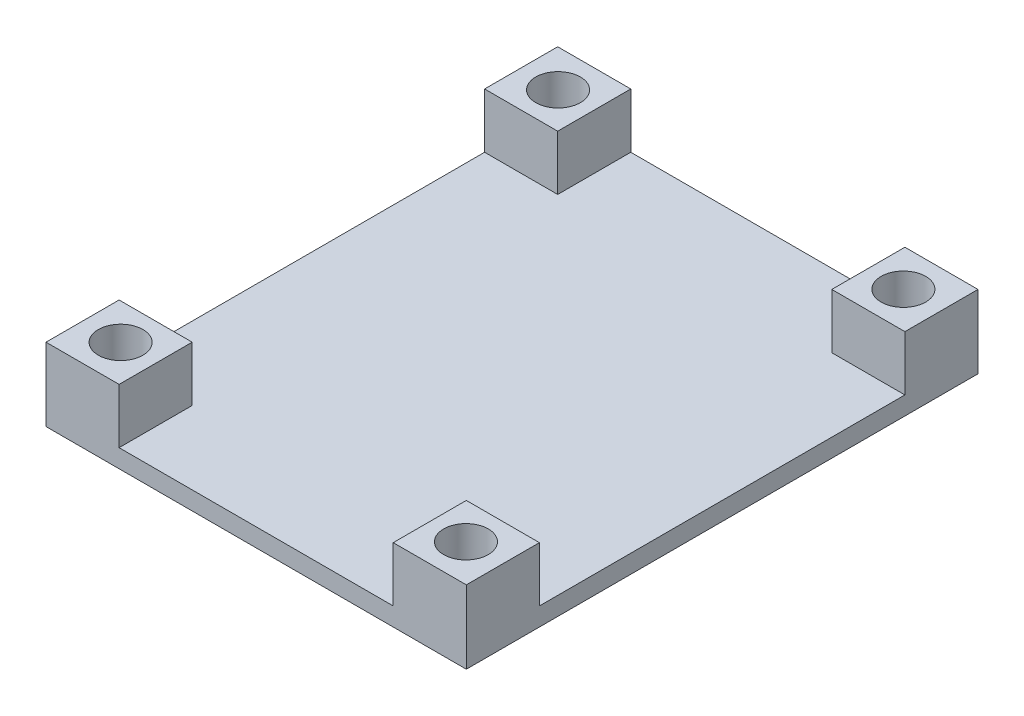
ISO-10303-21;
HEADER;
FILE_DESCRIPTION(('STEP AP214'),'2;1');
FILE_NAME('part.step','',(''),(''),'','','');
FILE_SCHEMA(('AUTOMOTIVE_DESIGN { 1 0 10303 214 1 1 1 1 }'));
ENDSEC;
DATA;
#1=APPLICATION_CONTEXT('core data for automotive mechanical design processes');
#2=APPLICATION_PROTOCOL_DEFINITION('international standard','automotive_design',2000,#1);
#3=PRODUCT_CONTEXT('',#1,'mechanical');
#4=PRODUCT('Part','Part','',(#3));
#5=PRODUCT_RELATED_PRODUCT_CATEGORY('part','',(#4));
#6=PRODUCT_DEFINITION_FORMATION('','',#4);
#7=PRODUCT_DEFINITION_CONTEXT('part definition',#1,'design');
#8=PRODUCT_DEFINITION('design','',#6,#7);
#9=PRODUCT_DEFINITION_SHAPE('','',#8);
#10=(LENGTH_UNIT() NAMED_UNIT(*) SI_UNIT(.MILLI.,.METRE.));
#11=(NAMED_UNIT(*) PLANE_ANGLE_UNIT() SI_UNIT($,.RADIAN.));
#12=(NAMED_UNIT(*) SI_UNIT($,.STERADIAN.) SOLID_ANGLE_UNIT());
#13=UNCERTAINTY_MEASURE_WITH_UNIT(LENGTH_MEASURE(1.E-05),#10,'distance_accuracy_value','');
#14=(GEOMETRIC_REPRESENTATION_CONTEXT(3) GLOBAL_UNCERTAINTY_ASSIGNED_CONTEXT((#13)) GLOBAL_UNIT_ASSIGNED_CONTEXT((#10,
#11,#12)) REPRESENTATION_CONTEXT('',''));
#15=CARTESIAN_POINT('',(0.,0.,0.));
#16=DIRECTION('',(0.,0.,1.));
#17=DIRECTION('',(1.,0.,0.));
#18=AXIS2_PLACEMENT_3D('',#15,#16,#17);
#19=CARTESIAN_POINT('',(0.,5.08,0.));
#20=DIRECTION('',(0.,1.,0.));
#21=DIRECTION('',(0.,0.,1.));
#22=AXIS2_PLACEMENT_3D('',#19,#20,#21);
#23=PLANE('',#22);
#24=DIRECTION('',(-1.,0.,0.));
#25=VECTOR('',#24,1.);
#26=CARTESIAN_POINT('',(0.,5.08,-9.19483735294118));
#27=LINE('',#26,#25);
#28=CARTESIAN_POINT('',(-7.31370588235292,5.08,-9.19483735294118));
#29=VERTEX_POINT('',#28);
#30=CARTESIAN_POINT('',(-12.3937058823529,5.08,-9.19483735294118));
#31=VERTEX_POINT('',#30);
#32=EDGE_CURVE('E180',#29,#31,#27,.T.);
#33=ORIENTED_EDGE('',*,*,#32,.F.);
#34=DIRECTION('',(0.,0.,-1.));
#35=VECTOR('',#34,1.);
#36=CARTESIAN_POINT('',(-7.31370588235292,5.08,0.));
#37=LINE('',#36,#35);
#38=CARTESIAN_POINT('',(-7.31370588235292,5.08,-14.2748373529412));
#39=VERTEX_POINT('',#38);
#40=EDGE_CURVE('E219',#29,#39,#37,.T.);
#41=ORIENTED_EDGE('',*,*,#40,.T.);
#42=DIRECTION('',(-1.,0.,0.));
#43=VECTOR('',#42,1.);
#44=CARTESIAN_POINT('',(-12.3937058823529,5.08,-14.2748373529412));
#45=LINE('',#44,#43);
#46=CARTESIAN_POINT('',(-12.3937058823529,5.08,-14.2748373529412));
#47=VERTEX_POINT('',#46);
#48=EDGE_CURVE('E57',#39,#47,#45,.T.);
#49=ORIENTED_EDGE('',*,*,#48,.T.);
#50=DIRECTION('',(0.,0.,1.));
#51=VECTOR('',#50,1.);
#52=CARTESIAN_POINT('',(-12.3937058823529,5.08,-14.2748373529412));
#53=LINE('',#52,#51);
#54=EDGE_CURVE('E271',#47,#31,#53,.T.);
#55=ORIENTED_EDGE('',*,*,#54,.T.);
#56=EDGE_LOOP('',(#33,#41,#49,#55));
#57=FACE_BOUND('',#56,.T.);
#58=CARTESIAN_POINT('',(-9.78870728235293,5.08,-11.6948323529412));
#59=DIRECTION('',(0.,1.,0.));
#60=DIRECTION('',(0.,0.,1.));
#61=AXIS2_PLACEMENT_3D('',#58,#59,#60);
#62=CIRCLE('',#61,1.5499969);
#63=CARTESIAN_POINT('',(-9.78870728235293,5.08,-10.1448354529412));
#64=VERTEX_POINT('',#63);
#65=EDGE_CURVE('E265',#64,#64,#62,.T.);
#66=ORIENTED_EDGE('',*,*,#65,.F.);
#67=EDGE_LOOP('',(#66));
#68=FACE_BOUND('',#67,.T.);
#69=ADVANCED_FACE('F33',(#57,#68),#23,.T.);
#70=DIRECTION('',(0.,0.,-1.));
#71=VECTOR('',#70,1.);
#72=CARTESIAN_POINT('',(11.7362941176471,5.08,0.));
#73=LINE('',#72,#71);
#74=CARTESIAN_POINT('',(11.7362941176471,5.08,-9.19483735294118));
#75=VERTEX_POINT('',#74);
#76=CARTESIAN_POINT('',(11.7362941176471,5.08,-14.2748373529412));
#77=VERTEX_POINT('',#76);
#78=EDGE_CURVE('E217',#75,#77,#73,.T.);
#79=ORIENTED_EDGE('',*,*,#78,.F.);
#80=DIRECTION('',(1.,0.,0.));
#81=VECTOR('',#80,1.);
#82=CARTESIAN_POINT('',(0.,5.08,-9.19483735294118));
#83=LINE('',#82,#81);
#84=CARTESIAN_POINT('',(16.8162941176471,5.08,-9.19483735294118));
#85=VERTEX_POINT('',#84);
#86=EDGE_CURVE('E214',#75,#85,#83,.T.);
#87=ORIENTED_EDGE('',*,*,#86,.T.);
#88=DIRECTION('',(0.,0.,-1.));
#89=VECTOR('',#88,1.);
#90=CARTESIAN_POINT('',(16.8162941176471,5.08,-14.2748373529412));
#91=LINE('',#90,#89);
#92=CARTESIAN_POINT('',(16.8162941176471,5.08,-14.2748373529412));
#93=VERTEX_POINT('',#92);
#94=EDGE_CURVE('E276',#85,#93,#91,.T.);
#95=ORIENTED_EDGE('',*,*,#94,.T.);
#96=EDGE_CURVE('E280',#93,#77,#45,.T.);
#97=ORIENTED_EDGE('',*,*,#96,.T.);
#98=EDGE_LOOP('',(#79,#87,#95,#97));
#99=FACE_BOUND('',#98,.T.);
#100=CARTESIAN_POINT('',(14.2112955176471,5.08,-11.6948323529412));
#101=DIRECTION('',(0.,1.,0.));
#102=DIRECTION('',(0.,0.,1.));
#103=AXIS2_PLACEMENT_3D('',#100,#101,#102);
#104=CIRCLE('',#103,1.5499969);
#105=CARTESIAN_POINT('',(14.2112955176471,5.08,-10.1448354529412));
#106=VERTEX_POINT('',#105);
#107=EDGE_CURVE('E259',#106,#106,#104,.T.);
#108=ORIENTED_EDGE('',*,*,#107,.F.);
#109=EDGE_LOOP('',(#108));
#110=FACE_BOUND('',#109,.T.);
#111=ADVANCED_FACE('F347',(#99,#110),#23,.T.);
#112=CARTESIAN_POINT('',(-9.78870728235293,5.08,18.7051576470588));
#113=DIRECTION('',(0.,1.,0.));
#114=DIRECTION('',(0.,0.,1.));
#115=AXIS2_PLACEMENT_3D('',#112,#113,#114);
#116=CIRCLE('',#115,1.5499969);
#117=CARTESIAN_POINT('',(-9.78870728235293,5.08,20.2551545470588));
#118=VERTEX_POINT('',#117);
#119=EDGE_CURVE('E247',#118,#118,#116,.T.);
#120=ORIENTED_EDGE('',*,*,#119,.F.);
#121=EDGE_LOOP('',(#120));
#122=FACE_BOUND('',#121,.T.);
#123=DIRECTION('',(0.,0.,1.));
#124=VECTOR('',#123,1.);
#125=CARTESIAN_POINT('',(-7.31370588235292,5.08,0.));
#126=LINE('',#125,#124);
#127=CARTESIAN_POINT('',(-7.31370588235292,5.08,16.2051626470588));
#128=VERTEX_POINT('',#127);
#129=CARTESIAN_POINT('',(-7.31370588235292,5.08,21.2851626470588));
#130=VERTEX_POINT('',#129);
#131=EDGE_CURVE('E207',#128,#130,#126,.T.);
#132=ORIENTED_EDGE('',*,*,#131,.F.);
#133=DIRECTION('',(-1.,0.,0.));
#134=VECTOR('',#133,1.);
#135=CARTESIAN_POINT('',(0.,5.08,16.2051626470588));
#136=LINE('',#135,#134);
#137=CARTESIAN_POINT('',(-12.3937058823529,5.08,16.2051626470588));
#138=VERTEX_POINT('',#137);
#139=EDGE_CURVE('E165',#128,#138,#136,.T.);
#140=ORIENTED_EDGE('',*,*,#139,.T.);
#141=CARTESIAN_POINT('',(-12.3937058823529,5.08,21.2851626470588));
#142=VERTEX_POINT('',#141);
#143=EDGE_CURVE('E87',#138,#142,#53,.T.);
#144=ORIENTED_EDGE('',*,*,#143,.T.);
#145=DIRECTION('',(1.,0.,0.));
#146=VECTOR('',#145,1.);
#147=CARTESIAN_POINT('',(-12.3937058823529,5.08,21.2851626470588));
#148=LINE('',#147,#146);
#149=EDGE_CURVE('E274',#142,#130,#148,.T.);
#150=ORIENTED_EDGE('',*,*,#149,.T.);
#151=EDGE_LOOP('',(#132,#140,#144,#150));
#152=FACE_BOUND('',#151,.T.);
#153=ADVANCED_FACE('F322',(#122,#152),#23,.T.);
#154=CARTESIAN_POINT('',(-12.3937058823529,5.08,-14.2748373529412));
#155=DIRECTION('',(1.,0.,0.));
#156=DIRECTION('',(0.,0.,-1.));
#157=AXIS2_PLACEMENT_3D('',#154,#155,#156);
#158=PLANE('',#157);
#159=DIRECTION('',(0.,1.,0.));
#160=VECTOR('',#159,1.);
#161=CARTESIAN_POINT('',(-12.3937058823529,1.27,16.2051626470588));
#162=LINE('',#161,#160);
#163=CARTESIAN_POINT('',(-12.3937058823529,1.27,16.2051626470588));
#164=VERTEX_POINT('',#163);
#165=EDGE_CURVE('E222',#164,#138,#162,.T.);
#166=ORIENTED_EDGE('',*,*,#165,.F.);
#167=DIRECTION('',(0.,0.,1.));
#168=VECTOR('',#167,1.);
#169=CARTESIAN_POINT('',(-12.3937058823529,1.27,0.));
#170=LINE('',#169,#168);
#171=CARTESIAN_POINT('',(-12.3937058823529,1.27,-9.19483735294118));
#172=VERTEX_POINT('',#171);
#173=EDGE_CURVE('E170',#172,#164,#170,.T.);
#174=ORIENTED_EDGE('',*,*,#173,.F.);
#175=DIRECTION('',(0.,1.,0.));
#176=VECTOR('',#175,1.);
#177=CARTESIAN_POINT('',(-12.3937058823529,1.27,-9.19483735294118));
#178=LINE('',#177,#176);
#179=EDGE_CURVE('E225',#172,#31,#178,.T.);
#180=ORIENTED_EDGE('',*,*,#179,.T.);
#181=ORIENTED_EDGE('',*,*,#54,.F.);
#182=DIRECTION('',(0.,-1.,0.));
#183=VECTOR('',#182,1.);
#184=CARTESIAN_POINT('',(-12.3937058823529,5.08,-14.2748373529412));
#185=LINE('',#184,#183);
#186=CARTESIAN_POINT('',(-12.3937058823529,0.,-14.2748373529412));
#187=VERTEX_POINT('',#186);
#188=EDGE_CURVE('E283',#47,#187,#185,.T.);
#189=ORIENTED_EDGE('',*,*,#188,.T.);
#190=DIRECTION('',(0.,0.,1.));
#191=VECTOR('',#190,1.);
#192=CARTESIAN_POINT('',(-12.3937058823529,0.,-14.2748373529412));
#193=LINE('',#192,#191);
#194=CARTESIAN_POINT('',(-12.3937058823529,0.,21.2851626470588));
#195=VERTEX_POINT('',#194);
#196=EDGE_CURVE('E268',#187,#195,#193,.T.);
#197=ORIENTED_EDGE('',*,*,#196,.T.);
#198=DIRECTION('',(0.,-1.,0.));
#199=VECTOR('',#198,1.);
#200=CARTESIAN_POINT('',(-12.3937058823529,5.08,21.2851626470588));
#201=LINE('',#200,#199);
#202=EDGE_CURVE('E11',#142,#195,#201,.T.);
#203=ORIENTED_EDGE('',*,*,#202,.F.);
#204=ORIENTED_EDGE('',*,*,#143,.F.);
#205=EDGE_LOOP('',(#166,#174,#180,#181,#189,#197,#203,#204));
#206=FACE_BOUND('',#205,.T.);
#207=ADVANCED_FACE('F35',(#206),#158,.F.);
#208=CARTESIAN_POINT('',(-12.3937058823529,5.08,21.2851626470588));
#209=DIRECTION('',(0.,0.,-1.));
#210=DIRECTION('',(-1.,0.,0.));
#211=AXIS2_PLACEMENT_3D('',#208,#209,#210);
#212=PLANE('',#211);
#213=DIRECTION('',(0.,1.,0.));
#214=VECTOR('',#213,1.);
#215=CARTESIAN_POINT('',(11.7362941176471,1.27,21.2851626470588));
#216=LINE('',#215,#214);
#217=CARTESIAN_POINT('',(11.7362941176471,1.27,21.2851626470588));
#218=VERTEX_POINT('',#217);
#219=CARTESIAN_POINT('',(11.7362941176471,5.08,21.2851626470588));
#220=VERTEX_POINT('',#219);
#221=EDGE_CURVE('E244',#218,#220,#216,.T.);
#222=ORIENTED_EDGE('',*,*,#221,.F.);
#223=DIRECTION('',(1.,0.,0.));
#224=VECTOR('',#223,1.);
#225=CARTESIAN_POINT('',(0.,1.27,21.2851626470588));
#226=LINE('',#225,#224);
#227=CARTESIAN_POINT('',(-7.31370588235292,1.27,21.2851626470588));
#228=VERTEX_POINT('',#227);
#229=EDGE_CURVE('E184',#228,#218,#226,.T.);
#230=ORIENTED_EDGE('',*,*,#229,.F.);
#231=DIRECTION('',(0.,1.,0.));
#232=VECTOR('',#231,1.);
#233=CARTESIAN_POINT('',(-7.31370588235292,1.27,21.2851626470588));
#234=LINE('',#233,#232);
#235=EDGE_CURVE('E169',#228,#130,#234,.T.);
#236=ORIENTED_EDGE('',*,*,#235,.T.);
#237=ORIENTED_EDGE('',*,*,#149,.F.);
#238=ORIENTED_EDGE('',*,*,#202,.T.);
#239=DIRECTION('',(1.,0.,0.));
#240=VECTOR('',#239,1.);
#241=CARTESIAN_POINT('',(-12.3937058823529,0.,21.2851626470588));
#242=LINE('',#241,#240);
#243=CARTESIAN_POINT('',(16.8162941176471,0.,21.2851626470588));
#244=VERTEX_POINT('',#243);
#245=EDGE_CURVE('E286',#195,#244,#242,.T.);
#246=ORIENTED_EDGE('',*,*,#245,.T.);
#247=DIRECTION('',(0.,-1.,0.));
#248=VECTOR('',#247,1.);
#249=CARTESIAN_POINT('',(16.8162941176471,5.08,21.2851626470588));
#250=LINE('',#249,#248);
#251=CARTESIAN_POINT('',(16.8162941176471,5.08,21.2851626470588));
#252=VERTEX_POINT('',#251);
#253=EDGE_CURVE('E41',#252,#244,#250,.T.);
#254=ORIENTED_EDGE('',*,*,#253,.F.);
#255=EDGE_CURVE('E273',#220,#252,#148,.T.);
#256=ORIENTED_EDGE('',*,*,#255,.F.);
#257=EDGE_LOOP('',(#222,#230,#236,#237,#238,#246,#254,#256));
#258=FACE_BOUND('',#257,.T.);
#259=ADVANCED_FACE('F324',(#258),#212,.F.);
#260=CARTESIAN_POINT('',(16.8162941176471,5.08,-14.2748373529412));
#261=DIRECTION('',(-1.,0.,0.));
#262=DIRECTION('',(0.,0.,1.));
#263=AXIS2_PLACEMENT_3D('',#260,#261,#262);
#264=PLANE('',#263);
#265=DIRECTION('',(0.,1.,0.));
#266=VECTOR('',#265,1.);
#267=CARTESIAN_POINT('',(16.8162941176471,1.27,-9.19483735294118));
#268=LINE('',#267,#266);
#269=CARTESIAN_POINT('',(16.8162941176471,1.27,-9.19483735294118));
#270=VERTEX_POINT('',#269);
#271=EDGE_CURVE('E237',#270,#85,#268,.T.);
#272=ORIENTED_EDGE('',*,*,#271,.F.);
#273=DIRECTION('',(0.,0.,-1.));
#274=VECTOR('',#273,1.);
#275=CARTESIAN_POINT('',(16.8162941176471,1.27,0.));
#276=LINE('',#275,#274);
#277=CARTESIAN_POINT('',(16.8162941176471,1.27,16.2051626470588));
#278=VERTEX_POINT('',#277);
#279=EDGE_CURVE('E193',#278,#270,#276,.T.);
#280=ORIENTED_EDGE('',*,*,#279,.F.);
#281=DIRECTION('',(0.,1.,0.));
#282=VECTOR('',#281,1.);
#283=CARTESIAN_POINT('',(16.8162941176471,1.27,16.2051626470588));
#284=LINE('',#283,#282);
#285=CARTESIAN_POINT('',(16.8162941176471,5.08,16.2051626470588));
#286=VERTEX_POINT('',#285);
#287=EDGE_CURVE('E239',#278,#286,#284,.T.);
#288=ORIENTED_EDGE('',*,*,#287,.T.);
#289=EDGE_CURVE('E277',#252,#286,#91,.T.);
#290=ORIENTED_EDGE('',*,*,#289,.F.);
#291=ORIENTED_EDGE('',*,*,#253,.T.);
#292=DIRECTION('',(0.,0.,-1.));
#293=VECTOR('',#292,1.);
#294=CARTESIAN_POINT('',(16.8162941176471,0.,-14.2748373529412));
#295=LINE('',#294,#293);
#296=CARTESIAN_POINT('',(16.8162941176471,0.,-14.2748373529412));
#297=VERTEX_POINT('',#296);
#298=EDGE_CURVE('E288',#244,#297,#295,.T.);
#299=ORIENTED_EDGE('',*,*,#298,.T.);
#300=DIRECTION('',(0.,-1.,0.));
#301=VECTOR('',#300,1.);
#302=CARTESIAN_POINT('',(16.8162941176471,5.08,-14.2748373529412));
#303=LINE('',#302,#301);
#304=EDGE_CURVE('E292',#93,#297,#303,.T.);
#305=ORIENTED_EDGE('',*,*,#304,.F.);
#306=ORIENTED_EDGE('',*,*,#94,.F.);
#307=EDGE_LOOP('',(#272,#280,#288,#290,#291,#299,#305,#306));
#308=FACE_BOUND('',#307,.T.);
#309=ADVANCED_FACE('F299',(#308),#264,.F.);
#310=CARTESIAN_POINT('',(-12.3937058823529,5.08,-14.2748373529412));
#311=DIRECTION('',(0.,0.,1.));
#312=DIRECTION('',(1.,0.,0.));
#313=AXIS2_PLACEMENT_3D('',#310,#311,#312);
#314=PLANE('',#313);
#315=DIRECTION('',(0.,1.,0.));
#316=VECTOR('',#315,1.);
#317=CARTESIAN_POINT('',(-7.31370588235292,1.27,-14.2748373529412));
#318=LINE('',#317,#316);
#319=CARTESIAN_POINT('',(-7.31370588235292,1.27,-14.2748373529412));
#320=VERTEX_POINT('',#319);
#321=EDGE_CURVE('E230',#320,#39,#318,.T.);
#322=ORIENTED_EDGE('',*,*,#321,.F.);
#323=DIRECTION('',(-1.,0.,0.));
#324=VECTOR('',#323,1.);
#325=CARTESIAN_POINT('',(0.,1.27,-14.2748373529412));
#326=LINE('',#325,#324);
#327=CARTESIAN_POINT('',(11.7362941176471,1.27,-14.2748373529412));
#328=VERTEX_POINT('',#327);
#329=EDGE_CURVE('E199',#328,#320,#326,.T.);
#330=ORIENTED_EDGE('',*,*,#329,.F.);
#331=DIRECTION('',(0.,1.,0.));
#332=VECTOR('',#331,1.);
#333=CARTESIAN_POINT('',(11.7362941176471,1.27,-14.2748373529412));
#334=LINE('',#333,#332);
#335=EDGE_CURVE('E232',#328,#77,#334,.T.);
#336=ORIENTED_EDGE('',*,*,#335,.T.);
#337=ORIENTED_EDGE('',*,*,#96,.F.);
#338=ORIENTED_EDGE('',*,*,#304,.T.);
#339=DIRECTION('',(-1.,0.,0.));
#340=VECTOR('',#339,1.);
#341=CARTESIAN_POINT('',(-12.3937058823529,0.,-14.2748373529412));
#342=LINE('',#341,#340);
#343=EDGE_CURVE('E79',#297,#187,#342,.T.);
#344=ORIENTED_EDGE('',*,*,#343,.T.);
#345=ORIENTED_EDGE('',*,*,#188,.F.);
#346=ORIENTED_EDGE('',*,*,#48,.F.);
#347=EDGE_LOOP('',(#322,#330,#336,#337,#338,#344,#345,#346));
#348=FACE_BOUND('',#347,.T.);
#349=ADVANCED_FACE('F311',(#348),#314,.F.);
#350=DIRECTION('',(1.,0.,0.));
#351=VECTOR('',#350,1.);
#352=CARTESIAN_POINT('',(0.,5.08,16.2051626470588));
#353=LINE('',#352,#351);
#354=CARTESIAN_POINT('',(11.7362941176471,5.08,16.2051626470588));
#355=VERTEX_POINT('',#354);
#356=EDGE_CURVE('E212',#355,#286,#353,.T.);
#357=ORIENTED_EDGE('',*,*,#356,.F.);
#358=DIRECTION('',(0.,0.,1.));
#359=VECTOR('',#358,1.);
#360=CARTESIAN_POINT('',(11.7362941176471,5.08,0.));
#361=LINE('',#360,#359);
#362=EDGE_CURVE('E209',#355,#220,#361,.T.);
#363=ORIENTED_EDGE('',*,*,#362,.T.);
#364=ORIENTED_EDGE('',*,*,#255,.T.);
#365=ORIENTED_EDGE('',*,*,#289,.T.);
#366=EDGE_LOOP('',(#357,#363,#364,#365));
#367=FACE_BOUND('',#366,.T.);
#368=CARTESIAN_POINT('',(14.2112955176471,5.08,18.7051576470588));
#369=DIRECTION('',(0.,1.,0.));
#370=DIRECTION('',(0.,0.,1.));
#371=AXIS2_PLACEMENT_3D('',#368,#369,#370);
#372=CIRCLE('',#371,1.5499969);
#373=CARTESIAN_POINT('',(14.2112955176471,5.08,20.2551545470588));
#374=VERTEX_POINT('',#373);
#375=EDGE_CURVE('E253',#374,#374,#372,.T.);
#376=ORIENTED_EDGE('',*,*,#375,.F.);
#377=EDGE_LOOP('',(#376));
#378=FACE_BOUND('',#377,.T.);
#379=ADVANCED_FACE('F334',(#367,#378),#23,.T.);
#380=CARTESIAN_POINT('',(0.,0.,0.));
#381=DIRECTION('',(0.,1.,0.));
#382=DIRECTION('',(0.,0.,1.));
#383=AXIS2_PLACEMENT_3D('',#380,#381,#382);
#384=PLANE('',#383);
#385=ORIENTED_EDGE('',*,*,#196,.F.);
#386=ORIENTED_EDGE('',*,*,#343,.F.);
#387=ORIENTED_EDGE('',*,*,#298,.F.);
#388=ORIENTED_EDGE('',*,*,#245,.F.);
#389=EDGE_LOOP('',(#385,#386,#387,#388));
#390=FACE_BOUND('',#389,.T.);
#391=CARTESIAN_POINT('',(-9.78870728235293,0.,-11.6948323529412));
#392=DIRECTION('',(0.,1.,0.));
#393=DIRECTION('',(0.,0.,1.));
#394=AXIS2_PLACEMENT_3D('',#391,#392,#393);
#395=CIRCLE('',#394,1.5499969);
#396=CARTESIAN_POINT('',(-9.78870728235293,0.,-10.1448354529412));
#397=VERTEX_POINT('',#396);
#398=EDGE_CURVE('E262',#397,#397,#395,.T.);
#399=ORIENTED_EDGE('',*,*,#398,.T.);
#400=EDGE_LOOP('',(#399));
#401=FACE_BOUND('',#400,.T.);
#402=CARTESIAN_POINT('',(14.2112955176471,0.,-11.6948323529412));
#403=DIRECTION('',(0.,1.,0.));
#404=DIRECTION('',(0.,0.,1.));
#405=AXIS2_PLACEMENT_3D('',#402,#403,#404);
#406=CIRCLE('',#405,1.5499969);
#407=CARTESIAN_POINT('',(14.2112955176471,0.,-10.1448354529412));
#408=VERTEX_POINT('',#407);
#409=EDGE_CURVE('E256',#408,#408,#406,.T.);
#410=ORIENTED_EDGE('',*,*,#409,.T.);
#411=EDGE_LOOP('',(#410));
#412=FACE_BOUND('',#411,.T.);
#413=CARTESIAN_POINT('',(14.2112955176471,0.,18.7051576470588));
#414=DIRECTION('',(0.,1.,0.));
#415=DIRECTION('',(0.,0.,1.));
#416=AXIS2_PLACEMENT_3D('',#413,#414,#415);
#417=CIRCLE('',#416,1.5499969);
#418=CARTESIAN_POINT('',(14.2112955176471,0.,20.2551545470588));
#419=VERTEX_POINT('',#418);
#420=EDGE_CURVE('E250',#419,#419,#417,.T.);
#421=ORIENTED_EDGE('',*,*,#420,.T.);
#422=EDGE_LOOP('',(#421));
#423=FACE_BOUND('',#422,.T.);
#424=CARTESIAN_POINT('',(-9.78870728235293,0.,18.7051576470588));
#425=DIRECTION('',(0.,1.,0.));
#426=DIRECTION('',(0.,0.,1.));
#427=AXIS2_PLACEMENT_3D('',#424,#425,#426);
#428=CIRCLE('',#427,1.5499969);
#429=CARTESIAN_POINT('',(-9.78870728235293,0.,20.2551545470588));
#430=VERTEX_POINT('',#429);
#431=EDGE_CURVE('E224',#430,#430,#428,.T.);
#432=ORIENTED_EDGE('',*,*,#431,.T.);
#433=EDGE_LOOP('',(#432));
#434=FACE_BOUND('',#433,.T.);
#435=ADVANCED_FACE('F305',(#390,#401,#412,#423,#434),#384,.F.);
#436=CARTESIAN_POINT('',(-9.78870728235293,5.08,-11.6948323529412));
#437=DIRECTION('',(0.,-1.,0.));
#438=DIRECTION('',(0.,0.,-1.));
#439=AXIS2_PLACEMENT_3D('',#436,#437,#438);
#440=CYLINDRICAL_SURFACE('',#439,1.5499969);
#441=ORIENTED_EDGE('',*,*,#65,.T.);
#442=EDGE_LOOP('',(#441));
#443=FACE_BOUND('',#442,.T.);
#444=ORIENTED_EDGE('',*,*,#398,.F.);
#445=EDGE_LOOP('',(#444));
#446=FACE_BOUND('',#445,.T.);
#447=ADVANCED_FACE('F360',(#443,#446),#440,.F.);
#448=CARTESIAN_POINT('',(14.2112955176471,5.08,-11.6948323529412));
#449=DIRECTION('',(0.,-1.,0.));
#450=DIRECTION('',(0.,0.,-1.));
#451=AXIS2_PLACEMENT_3D('',#448,#449,#450);
#452=CYLINDRICAL_SURFACE('',#451,1.5499969);
#453=ORIENTED_EDGE('',*,*,#107,.T.);
#454=EDGE_LOOP('',(#453));
#455=FACE_BOUND('',#454,.T.);
#456=ORIENTED_EDGE('',*,*,#409,.F.);
#457=EDGE_LOOP('',(#456));
#458=FACE_BOUND('',#457,.T.);
#459=ADVANCED_FACE('F381',(#455,#458),#452,.F.);
#460=CARTESIAN_POINT('',(14.2112955176471,5.08,18.7051576470588));
#461=DIRECTION('',(0.,-1.,0.));
#462=DIRECTION('',(0.,0.,-1.));
#463=AXIS2_PLACEMENT_3D('',#460,#461,#462);
#464=CYLINDRICAL_SURFACE('',#463,1.5499969);
#465=ORIENTED_EDGE('',*,*,#375,.T.);
#466=EDGE_LOOP('',(#465));
#467=FACE_BOUND('',#466,.T.);
#468=ORIENTED_EDGE('',*,*,#420,.F.);
#469=EDGE_LOOP('',(#468));
#470=FACE_BOUND('',#469,.T.);
#471=ADVANCED_FACE('F372',(#467,#470),#464,.F.);
#472=CARTESIAN_POINT('',(-9.78870728235293,5.08,18.7051576470588));
#473=DIRECTION('',(0.,-1.,0.));
#474=DIRECTION('',(0.,0.,-1.));
#475=AXIS2_PLACEMENT_3D('',#472,#473,#474);
#476=CYLINDRICAL_SURFACE('',#475,1.5499969);
#477=ORIENTED_EDGE('',*,*,#119,.T.);
#478=EDGE_LOOP('',(#477));
#479=FACE_BOUND('',#478,.T.);
#480=ORIENTED_EDGE('',*,*,#431,.F.);
#481=EDGE_LOOP('',(#480));
#482=FACE_BOUND('',#481,.T.);
#483=ADVANCED_FACE('F369',(#479,#482),#476,.F.);
#484=CARTESIAN_POINT('',(0.,1.27,16.2051626470588));
#485=DIRECTION('',(0.,0.,-1.));
#486=DIRECTION('',(-1.,0.,0.));
#487=AXIS2_PLACEMENT_3D('',#484,#485,#486);
#488=PLANE('',#487);
#489=ORIENTED_EDGE('',*,*,#139,.F.);
#490=DIRECTION('',(0.,1.,0.));
#491=VECTOR('',#490,1.);
#492=CARTESIAN_POINT('',(-7.31370588235292,1.27,16.2051626470588));
#493=LINE('',#492,#491);
#494=CARTESIAN_POINT('',(-7.31370588235292,1.27,16.2051626470588));
#495=VERTEX_POINT('',#494);
#496=EDGE_CURVE('E160',#495,#128,#493,.T.);
#497=ORIENTED_EDGE('',*,*,#496,.F.);
#498=DIRECTION('',(-1.,0.,0.));
#499=VECTOR('',#498,1.);
#500=CARTESIAN_POINT('',(0.,1.27,16.2051626470588));
#501=LINE('',#500,#499);
#502=EDGE_CURVE('E163',#495,#164,#501,.T.);
#503=ORIENTED_EDGE('',*,*,#502,.T.);
#504=ORIENTED_EDGE('',*,*,#165,.T.);
#505=EDGE_LOOP('',(#489,#497,#503,#504));
#506=FACE_BOUND('',#505,.T.);
#507=ADVANCED_FACE('F162',(#506),#488,.T.);
#508=CARTESIAN_POINT('',(0.,1.27,-9.19483735294118));
#509=DIRECTION('',(0.,0.,-1.));
#510=DIRECTION('',(-1.,0.,0.));
#511=AXIS2_PLACEMENT_3D('',#508,#509,#510);
#512=PLANE('',#511);
#513=ORIENTED_EDGE('',*,*,#32,.T.);
#514=ORIENTED_EDGE('',*,*,#179,.F.);
#515=DIRECTION('',(-1.,0.,0.));
#516=VECTOR('',#515,1.);
#517=CARTESIAN_POINT('',(0.,1.27,-9.19483735294118));
#518=LINE('',#517,#516);
#519=CARTESIAN_POINT('',(-7.31370588235292,1.27,-9.19483735294118));
#520=VERTEX_POINT('',#519);
#521=EDGE_CURVE('E203',#520,#172,#518,.T.);
#522=ORIENTED_EDGE('',*,*,#521,.F.);
#523=DIRECTION('',(0.,1.,0.));
#524=VECTOR('',#523,1.);
#525=CARTESIAN_POINT('',(-7.31370588235292,1.27,-9.19483735294118));
#526=LINE('',#525,#524);
#527=EDGE_CURVE('E228',#520,#29,#526,.T.);
#528=ORIENTED_EDGE('',*,*,#527,.T.);
#529=EDGE_LOOP('',(#513,#514,#522,#528));
#530=FACE_BOUND('',#529,.T.);
#531=ADVANCED_FACE('F320',(#530),#512,.F.);
#532=CARTESIAN_POINT('',(-7.31370588235292,1.27,0.));
#533=DIRECTION('',(1.,0.,0.));
#534=DIRECTION('',(0.,0.,-1.));
#535=AXIS2_PLACEMENT_3D('',#532,#533,#534);
#536=PLANE('',#535);
#537=ORIENTED_EDGE('',*,*,#40,.F.);
#538=ORIENTED_EDGE('',*,*,#527,.F.);
#539=DIRECTION('',(0.,0.,-1.));
#540=VECTOR('',#539,1.);
#541=CARTESIAN_POINT('',(-7.31370588235292,1.27,0.));
#542=LINE('',#541,#540);
#543=EDGE_CURVE('E201',#520,#320,#542,.T.);
#544=ORIENTED_EDGE('',*,*,#543,.T.);
#545=ORIENTED_EDGE('',*,*,#321,.T.);
#546=EDGE_LOOP('',(#537,#538,#544,#545));
#547=FACE_BOUND('',#546,.T.);
#548=ADVANCED_FACE('F315',(#547),#536,.T.);
#549=CARTESIAN_POINT('',(11.7362941176471,1.27,0.));
#550=DIRECTION('',(1.,0.,0.));
#551=DIRECTION('',(0.,0.,-1.));
#552=AXIS2_PLACEMENT_3D('',#549,#550,#551);
#553=PLANE('',#552);
#554=ORIENTED_EDGE('',*,*,#78,.T.);
#555=ORIENTED_EDGE('',*,*,#335,.F.);
#556=DIRECTION('',(0.,0.,-1.));
#557=VECTOR('',#556,1.);
#558=CARTESIAN_POINT('',(11.7362941176471,1.27,0.));
#559=LINE('',#558,#557);
#560=CARTESIAN_POINT('',(11.7362941176471,1.27,-9.19483735294118));
#561=VERTEX_POINT('',#560);
#562=EDGE_CURVE('E48',#561,#328,#559,.T.);
#563=ORIENTED_EDGE('',*,*,#562,.F.);
#564=DIRECTION('',(0.,1.,0.));
#565=VECTOR('',#564,1.);
#566=CARTESIAN_POINT('',(11.7362941176471,1.27,-9.19483735294118));
#567=LINE('',#566,#565);
#568=EDGE_CURVE('E235',#561,#75,#567,.T.);
#569=ORIENTED_EDGE('',*,*,#568,.T.);
#570=EDGE_LOOP('',(#554,#555,#563,#569));
#571=FACE_BOUND('',#570,.T.);
#572=ADVANCED_FACE('F483',(#571),#553,.F.);
#573=CARTESIAN_POINT('',(0.,1.27,-9.19483735294118));
#574=DIRECTION('',(0.,0.,1.));
#575=DIRECTION('',(1.,0.,0.));
#576=AXIS2_PLACEMENT_3D('',#573,#574,#575);
#577=PLANE('',#576);
#578=ORIENTED_EDGE('',*,*,#86,.F.);
#579=ORIENTED_EDGE('',*,*,#568,.F.);
#580=DIRECTION('',(1.,0.,0.));
#581=VECTOR('',#580,1.);
#582=CARTESIAN_POINT('',(0.,1.27,-9.19483735294118));
#583=LINE('',#582,#581);
#584=EDGE_CURVE('E196',#561,#270,#583,.T.);
#585=ORIENTED_EDGE('',*,*,#584,.T.);
#586=ORIENTED_EDGE('',*,*,#271,.T.);
#587=EDGE_LOOP('',(#578,#579,#585,#586));
#588=FACE_BOUND('',#587,.T.);
#589=ADVANCED_FACE('F344',(#588),#577,.T.);
#590=CARTESIAN_POINT('',(0.,1.27,16.2051626470588));
#591=DIRECTION('',(0.,0.,1.));
#592=DIRECTION('',(1.,0.,0.));
#593=AXIS2_PLACEMENT_3D('',#590,#591,#592);
#594=PLANE('',#593);
#595=ORIENTED_EDGE('',*,*,#356,.T.);
#596=ORIENTED_EDGE('',*,*,#287,.F.);
#597=DIRECTION('',(1.,0.,0.));
#598=VECTOR('',#597,1.);
#599=CARTESIAN_POINT('',(0.,1.27,16.2051626470588));
#600=LINE('',#599,#598);
#601=CARTESIAN_POINT('',(11.7362941176471,1.27,16.2051626470588));
#602=VERTEX_POINT('',#601);
#603=EDGE_CURVE('E190',#602,#278,#600,.T.);
#604=ORIENTED_EDGE('',*,*,#603,.F.);
#605=DIRECTION('',(0.,1.,0.));
#606=VECTOR('',#605,1.);
#607=CARTESIAN_POINT('',(11.7362941176471,1.27,16.2051626470588));
#608=LINE('',#607,#606);
#609=EDGE_CURVE('E242',#602,#355,#608,.T.);
#610=ORIENTED_EDGE('',*,*,#609,.T.);
#611=EDGE_LOOP('',(#595,#596,#604,#610));
#612=FACE_BOUND('',#611,.T.);
#613=ADVANCED_FACE('F330',(#612),#594,.F.);
#614=CARTESIAN_POINT('',(11.7362941176471,1.27,0.));
#615=DIRECTION('',(-1.,0.,0.));
#616=DIRECTION('',(0.,0.,1.));
#617=AXIS2_PLACEMENT_3D('',#614,#615,#616);
#618=PLANE('',#617);
#619=ORIENTED_EDGE('',*,*,#362,.F.);
#620=ORIENTED_EDGE('',*,*,#609,.F.);
#621=DIRECTION('',(0.,0.,1.));
#622=VECTOR('',#621,1.);
#623=CARTESIAN_POINT('',(11.7362941176471,1.27,0.));
#624=LINE('',#623,#622);
#625=EDGE_CURVE('E186',#602,#218,#624,.T.);
#626=ORIENTED_EDGE('',*,*,#625,.T.);
#627=ORIENTED_EDGE('',*,*,#221,.T.);
#628=EDGE_LOOP('',(#619,#620,#626,#627));
#629=FACE_BOUND('',#628,.T.);
#630=ADVANCED_FACE('F336',(#629),#618,.T.);
#631=CARTESIAN_POINT('',(-7.31370588235292,1.27,0.));
#632=DIRECTION('',(-1.,0.,0.));
#633=DIRECTION('',(0.,0.,1.));
#634=AXIS2_PLACEMENT_3D('',#631,#632,#633);
#635=PLANE('',#634);
#636=ORIENTED_EDGE('',*,*,#131,.T.);
#637=ORIENTED_EDGE('',*,*,#235,.F.);
#638=DIRECTION('',(0.,0.,1.));
#639=VECTOR('',#638,1.);
#640=CARTESIAN_POINT('',(-7.31370588235292,1.27,0.));
#641=LINE('',#640,#639);
#642=EDGE_CURVE('E175',#495,#228,#641,.T.);
#643=ORIENTED_EDGE('',*,*,#642,.F.);
#644=ORIENTED_EDGE('',*,*,#496,.T.);
#645=EDGE_LOOP('',(#636,#637,#643,#644));
#646=FACE_BOUND('',#645,.T.);
#647=ADVANCED_FACE('F182',(#646),#635,.F.);
#648=CARTESIAN_POINT('',(0.,1.27,0.));
#649=DIRECTION('',(0.,1.,0.));
#650=DIRECTION('',(0.,0.,1.));
#651=AXIS2_PLACEMENT_3D('',#648,#649,#650);
#652=PLANE('',#651);
#653=ORIENTED_EDGE('',*,*,#502,.F.);
#654=ORIENTED_EDGE('',*,*,#642,.T.);
#655=ORIENTED_EDGE('',*,*,#229,.T.);
#656=ORIENTED_EDGE('',*,*,#625,.F.);
#657=ORIENTED_EDGE('',*,*,#603,.T.);
#658=ORIENTED_EDGE('',*,*,#279,.T.);
#659=ORIENTED_EDGE('',*,*,#584,.F.);
#660=ORIENTED_EDGE('',*,*,#562,.T.);
#661=ORIENTED_EDGE('',*,*,#329,.T.);
#662=ORIENTED_EDGE('',*,*,#543,.F.);
#663=ORIENTED_EDGE('',*,*,#521,.T.);
#664=ORIENTED_EDGE('',*,*,#173,.T.);
#665=EDGE_LOOP('',(#653,#654,#655,#656,#657,#658,#659,#660,#661,#662,#663,#664));
#666=FACE_BOUND('',#665,.T.);
#667=ADVANCED_FACE('F173',(#666),#652,.T.);
#668=CLOSED_SHELL('',(#69,#111,#153,#207,#259,#309,#349,#379,#435,#447,#459,#471,#483,#507,#531,
#548,#572,#589,#613,#630,#647,#667));
#669=MANIFOLD_SOLID_BREP('B2',#668);
#670=ADVANCED_BREP_SHAPE_REPRESENTATION('',(#18,#669),#14);
#671=SHAPE_DEFINITION_REPRESENTATION(#9,#670);
ENDSEC;
END-ISO-10303-21;
